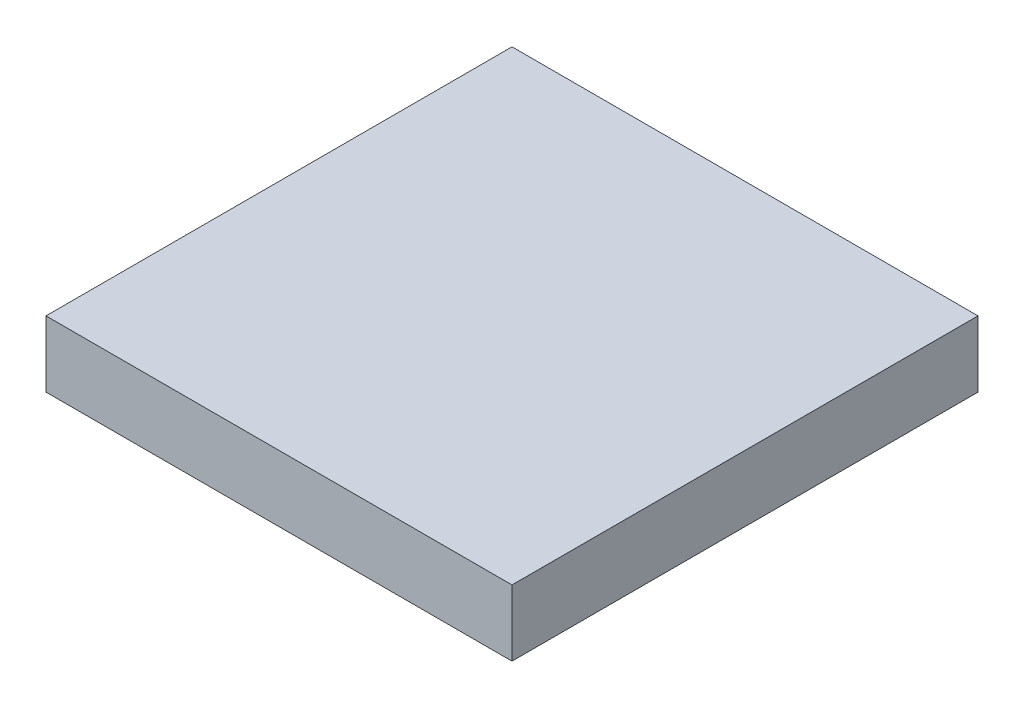
ISO-10303-21;
HEADER;
FILE_DESCRIPTION(('STEP AP214'),'2;1');
FILE_NAME('part.step','',(''),(''),'','','');
FILE_SCHEMA(('AUTOMOTIVE_DESIGN { 1 0 10303 214 1 1 1 1 }'));
ENDSEC;
DATA;
#1=APPLICATION_CONTEXT('core data for automotive mechanical design processes');
#2=APPLICATION_PROTOCOL_DEFINITION('international standard','automotive_design',2000,#1);
#3=PRODUCT_CONTEXT('',#1,'mechanical');
#4=PRODUCT('Part','Part','',(#3));
#5=PRODUCT_RELATED_PRODUCT_CATEGORY('part','',(#4));
#6=PRODUCT_DEFINITION_FORMATION('','',#4);
#7=PRODUCT_DEFINITION_CONTEXT('part definition',#1,'design');
#8=PRODUCT_DEFINITION('design','',#6,#7);
#9=PRODUCT_DEFINITION_SHAPE('','',#8);
#10=(LENGTH_UNIT() NAMED_UNIT(*) SI_UNIT(.MILLI.,.METRE.));
#11=(NAMED_UNIT(*) PLANE_ANGLE_UNIT() SI_UNIT($,.RADIAN.));
#12=(NAMED_UNIT(*) SI_UNIT($,.STERADIAN.) SOLID_ANGLE_UNIT());
#13=UNCERTAINTY_MEASURE_WITH_UNIT(LENGTH_MEASURE(1.E-05),#10,'distance_accuracy_value','');
#14=(GEOMETRIC_REPRESENTATION_CONTEXT(3) GLOBAL_UNCERTAINTY_ASSIGNED_CONTEXT((#13)) GLOBAL_UNIT_ASSIGNED_CONTEXT((#10,
#11,#12)) REPRESENTATION_CONTEXT('',''));
#15=CARTESIAN_POINT('',(0.,0.,0.));
#16=DIRECTION('',(0.,0.,1.));
#17=DIRECTION('',(1.,0.,0.));
#18=AXIS2_PLACEMENT_3D('',#15,#16,#17);
#19=CARTESIAN_POINT('',(19.05,5.4,-19.05));
#20=DIRECTION('',(-1.,0.,0.));
#21=DIRECTION('',(0.,0.,1.));
#22=AXIS2_PLACEMENT_3D('',#19,#20,#21);
#23=PLANE('',#22);
#24=DIRECTION('',(0.,0.,-1.));
#25=VECTOR('',#24,1.);
#26=CARTESIAN_POINT('',(19.05,0.,-19.05));
#27=LINE('',#26,#25);
#28=CARTESIAN_POINT('',(19.05,0.,19.05));
#29=VERTEX_POINT('',#28);
#30=CARTESIAN_POINT('',(19.05,0.,-19.05));
#31=VERTEX_POINT('',#30);
#32=EDGE_CURVE('E113',#29,#31,#27,.T.);
#33=ORIENTED_EDGE('',*,*,#32,.T.);
#34=DIRECTION('',(0.,-1.,0.));
#35=VECTOR('',#34,1.);
#36=CARTESIAN_POINT('',(19.05,5.4,-19.05));
#37=LINE('',#36,#35);
#38=CARTESIAN_POINT('',(19.05,5.4,-19.05));
#39=VERTEX_POINT('',#38);
#40=EDGE_CURVE('E11',#39,#31,#37,.T.);
#41=ORIENTED_EDGE('',*,*,#40,.F.);
#42=DIRECTION('',(0.,0.,-1.));
#43=VECTOR('',#42,1.);
#44=CARTESIAN_POINT('',(19.05,5.4,-19.05));
#45=LINE('',#44,#43);
#46=CARTESIAN_POINT('',(19.05,5.4,19.05));
#47=VERTEX_POINT('',#46);
#48=EDGE_CURVE('E97',#47,#39,#45,.T.);
#49=ORIENTED_EDGE('',*,*,#48,.F.);
#50=DIRECTION('',(0.,-1.,0.));
#51=VECTOR('',#50,1.);
#52=CARTESIAN_POINT('',(19.05,5.4,19.05));
#53=LINE('',#52,#51);
#54=EDGE_CURVE('E109',#47,#29,#53,.T.);
#55=ORIENTED_EDGE('',*,*,#54,.T.);
#56=EDGE_LOOP('',(#33,#41,#49,#55));
#57=FACE_BOUND('',#56,.T.);
#58=ADVANCED_FACE('F45',(#57),#23,.F.);
#59=CARTESIAN_POINT('',(-19.05,5.4,-19.05));
#60=DIRECTION('',(0.,0.,1.));
#61=DIRECTION('',(1.,0.,0.));
#62=AXIS2_PLACEMENT_3D('',#59,#60,#61);
#63=PLANE('',#62);
#64=DIRECTION('',(-1.,0.,0.));
#65=VECTOR('',#64,1.);
#66=CARTESIAN_POINT('',(-19.05,0.,-19.05));
#67=LINE('',#66,#65);
#68=CARTESIAN_POINT('',(-19.05,0.,-19.05));
#69=VERTEX_POINT('',#68);
#70=EDGE_CURVE('E102',#31,#69,#67,.T.);
#71=ORIENTED_EDGE('',*,*,#70,.T.);
#72=DIRECTION('',(0.,-1.,0.));
#73=VECTOR('',#72,1.);
#74=CARTESIAN_POINT('',(-19.05,5.4,-19.05));
#75=LINE('',#74,#73);
#76=CARTESIAN_POINT('',(-19.05,5.4,-19.05));
#77=VERTEX_POINT('',#76);
#78=EDGE_CURVE('E54',#77,#69,#75,.T.);
#79=ORIENTED_EDGE('',*,*,#78,.F.);
#80=DIRECTION('',(-1.,0.,0.));
#81=VECTOR('',#80,1.);
#82=CARTESIAN_POINT('',(-19.05,5.4,-19.05));
#83=LINE('',#82,#81);
#84=EDGE_CURVE('E92',#39,#77,#83,.T.);
#85=ORIENTED_EDGE('',*,*,#84,.F.);
#86=ORIENTED_EDGE('',*,*,#40,.T.);
#87=EDGE_LOOP('',(#71,#79,#85,#86));
#88=FACE_BOUND('',#87,.T.);
#89=ADVANCED_FACE('F101',(#88),#63,.F.);
#90=CARTESIAN_POINT('',(-19.05,5.4,-19.05));
#91=DIRECTION('',(1.,0.,0.));
#92=DIRECTION('',(0.,0.,-1.));
#93=AXIS2_PLACEMENT_3D('',#90,#91,#92);
#94=PLANE('',#93);
#95=DIRECTION('',(0.,0.,1.));
#96=VECTOR('',#95,1.);
#97=CARTESIAN_POINT('',(-19.05,0.,-19.05));
#98=LINE('',#97,#96);
#99=CARTESIAN_POINT('',(-19.05,0.,19.05));
#100=VERTEX_POINT('',#99);
#101=EDGE_CURVE('E79',#69,#100,#98,.T.);
#102=ORIENTED_EDGE('',*,*,#101,.T.);
#103=DIRECTION('',(0.,-1.,0.));
#104=VECTOR('',#103,1.);
#105=CARTESIAN_POINT('',(-19.05,5.4,19.05));
#106=LINE('',#105,#104);
#107=CARTESIAN_POINT('',(-19.05,5.4,19.05));
#108=VERTEX_POINT('',#107);
#109=EDGE_CURVE('E104',#108,#100,#106,.T.);
#110=ORIENTED_EDGE('',*,*,#109,.F.);
#111=DIRECTION('',(0.,0.,1.));
#112=VECTOR('',#111,1.);
#113=CARTESIAN_POINT('',(-19.05,5.4,-19.05));
#114=LINE('',#113,#112);
#115=EDGE_CURVE('E95',#77,#108,#114,.T.);
#116=ORIENTED_EDGE('',*,*,#115,.F.);
#117=ORIENTED_EDGE('',*,*,#78,.T.);
#118=EDGE_LOOP('',(#102,#110,#116,#117));
#119=FACE_BOUND('',#118,.T.);
#120=ADVANCED_FACE('F105',(#119),#94,.F.);
#121=CARTESIAN_POINT('',(-19.05,5.4,19.05));
#122=DIRECTION('',(0.,0.,-1.));
#123=DIRECTION('',(-1.,0.,0.));
#124=AXIS2_PLACEMENT_3D('',#121,#122,#123);
#125=PLANE('',#124);
#126=DIRECTION('',(1.,0.,0.));
#127=VECTOR('',#126,1.);
#128=CARTESIAN_POINT('',(-19.05,0.,19.05));
#129=LINE('',#128,#127);
#130=EDGE_CURVE('E85',#100,#29,#129,.T.);
#131=ORIENTED_EDGE('',*,*,#130,.T.);
#132=ORIENTED_EDGE('',*,*,#54,.F.);
#133=DIRECTION('',(1.,0.,0.));
#134=VECTOR('',#133,1.);
#135=CARTESIAN_POINT('',(-19.05,5.4,19.05));
#136=LINE('',#135,#134);
#137=EDGE_CURVE('E62',#108,#47,#136,.T.);
#138=ORIENTED_EDGE('',*,*,#137,.F.);
#139=ORIENTED_EDGE('',*,*,#109,.T.);
#140=EDGE_LOOP('',(#131,#132,#138,#139));
#141=FACE_BOUND('',#140,.T.);
#142=ADVANCED_FACE('F126',(#141),#125,.F.);
#143=CARTESIAN_POINT('',(0.,5.4,0.));
#144=DIRECTION('',(0.,1.,0.));
#145=DIRECTION('',(0.,0.,1.));
#146=AXIS2_PLACEMENT_3D('',#143,#144,#145);
#147=PLANE('',#146);
#148=ORIENTED_EDGE('',*,*,#48,.T.);
#149=ORIENTED_EDGE('',*,*,#84,.T.);
#150=ORIENTED_EDGE('',*,*,#115,.T.);
#151=ORIENTED_EDGE('',*,*,#137,.T.);
#152=EDGE_LOOP('',(#148,#149,#150,#151));
#153=FACE_BOUND('',#152,.T.);
#154=ADVANCED_FACE('F93',(#153),#147,.T.);
#155=CARTESIAN_POINT('',(0.,0.,0.));
#156=DIRECTION('',(0.,1.,0.));
#157=DIRECTION('',(0.,0.,1.));
#158=AXIS2_PLACEMENT_3D('',#155,#156,#157);
#159=PLANE('',#158);
#160=ORIENTED_EDGE('',*,*,#32,.F.);
#161=ORIENTED_EDGE('',*,*,#130,.F.);
#162=ORIENTED_EDGE('',*,*,#101,.F.);
#163=ORIENTED_EDGE('',*,*,#70,.F.);
#164=EDGE_LOOP('',(#160,#161,#162,#163));
#165=FACE_BOUND('',#164,.T.);
#166=ADVANCED_FACE('F129',(#165),#159,.F.);
#167=CLOSED_SHELL('',(#58,#89,#120,#142,#154,#166));
#168=MANIFOLD_SOLID_BREP('B2',#167);
#169=ADVANCED_BREP_SHAPE_REPRESENTATION('',(#18,#168),#14);
#170=SHAPE_DEFINITION_REPRESENTATION(#9,#169);
ENDSEC;
END-ISO-10303-21;
